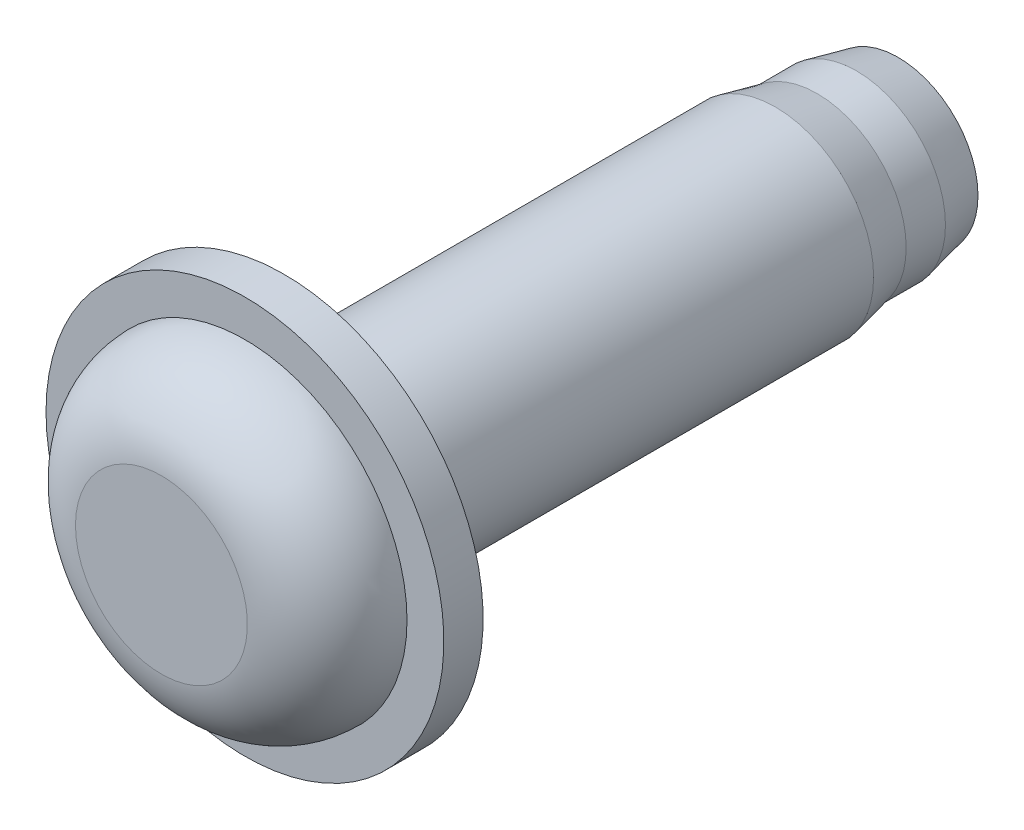
ISO-10303-21;
HEADER;
FILE_DESCRIPTION(('STEP AP214'),'2;1');
FILE_NAME('part.step','',(''),(''),'','','');
FILE_SCHEMA(('AUTOMOTIVE_DESIGN { 1 0 10303 214 1 1 1 1 }'));
ENDSEC;
DATA;
#1=APPLICATION_CONTEXT('core data for automotive mechanical design processes');
#2=APPLICATION_PROTOCOL_DEFINITION('international standard','automotive_design',2000,#1);
#3=PRODUCT_CONTEXT('',#1,'mechanical');
#4=PRODUCT('Part','Part','',(#3));
#5=PRODUCT_RELATED_PRODUCT_CATEGORY('part','',(#4));
#6=PRODUCT_DEFINITION_FORMATION('','',#4);
#7=PRODUCT_DEFINITION_CONTEXT('part definition',#1,'design');
#8=PRODUCT_DEFINITION('design','',#6,#7);
#9=PRODUCT_DEFINITION_SHAPE('','',#8);
#10=(LENGTH_UNIT() NAMED_UNIT(*) SI_UNIT(.MILLI.,.METRE.));
#11=(NAMED_UNIT(*) PLANE_ANGLE_UNIT() SI_UNIT($,.RADIAN.));
#12=(NAMED_UNIT(*) SI_UNIT($,.STERADIAN.) SOLID_ANGLE_UNIT());
#13=UNCERTAINTY_MEASURE_WITH_UNIT(LENGTH_MEASURE(1.E-05),#10,'distance_accuracy_value','');
#14=(GEOMETRIC_REPRESENTATION_CONTEXT(3) GLOBAL_UNCERTAINTY_ASSIGNED_CONTEXT((#13)) GLOBAL_UNIT_ASSIGNED_CONTEXT((#10,
#11,#12)) REPRESENTATION_CONTEXT('',''));
#15=CARTESIAN_POINT('',(0.,0.,0.));
#16=DIRECTION('',(0.,0.,1.));
#17=DIRECTION('',(1.,0.,0.));
#18=AXIS2_PLACEMENT_3D('',#15,#16,#17);
#19=CARTESIAN_POINT('',(3.542,-3.542,5.));
#20=DIRECTION('',(0.,0.,-1.));
#21=DIRECTION('',(-1.,0.,0.));
#22=AXIS2_PLACEMENT_3D('',#19,#20,#21);
#23=PLANE('',#22);
#24=CARTESIAN_POINT('',(0.,0.,5.));
#25=DIRECTION('',(0.,0.,-1.));
#26=DIRECTION('',(-1.,0.,0.));
#27=AXIS2_PLACEMENT_3D('',#24,#25,#26);
#28=CIRCLE('',#27,3.5000000032038);
#29=CARTESIAN_POINT('',(-3.5000000032038,0.,5.));
#30=VERTEX_POINT('',#29);
#31=EDGE_CURVE('E61',#30,#30,#28,.T.);
#32=ORIENTED_EDGE('',*,*,#31,.F.);
#33=EDGE_LOOP('',(#32));
#34=FACE_BOUND('',#33,.T.);
#35=ADVANCED_FACE('F16',(#34),#23,.F.);
#36=CARTESIAN_POINT('',(-3.18548387118952,0.,1.60000000024521));
#37=DIRECTION('',(0.,1.,0.));
#38=DIRECTION('',(-1.,0.,0.));
#39=AXIS2_PLACEMENT_3D('',#36,#37,#38);
#40=CIRCLE('',#39,3.41451612906277);
#41=TRIMMED_CURVE('',#40,(PARAMETER_VALUE(-2.77324600670561)),
(PARAMETER_VALUE(2.77324600670561)),.T.,.PARAMETER.);
#42=CARTESIAN_POINT('',(0.,0.,1.60000000024521));
#43=DIRECTION('',(0.,0.,-1.));
#44=AXIS1_PLACEMENT('',#42,#43);
#45=SURFACE_OF_REVOLUTION('',#41,#44);
#46=ORIENTED_EDGE('',*,*,#31,.T.);
#47=EDGE_LOOP('',(#46));
#48=FACE_BOUND('',#47,.T.);
#49=CARTESIAN_POINT('',(0.,0.,1.6));
#50=DIRECTION('',(0.,0.,-1.));
#51=DIRECTION('',(-1.,0.,0.));
#52=AXIS2_PLACEMENT_3D('',#49,#50,#51);
#53=CIRCLE('',#52,6.60000000025228);
#54=CARTESIAN_POINT('',(-6.60000000025228,0.,1.6));
#55=VERTEX_POINT('',#54);
#56=EDGE_CURVE('E297',#55,#55,#53,.F.);
#57=ORIENTED_EDGE('',*,*,#56,.T.);
#58=EDGE_LOOP('',(#57));
#59=FACE_BOUND('',#58,.T.);
#60=ADVANCED_FACE('F151',(#48,#59),#45,.F.);
#61=CARTESIAN_POINT('',(8.1972,-8.1972,1.6));
#62=DIRECTION('',(0.,0.,-1.));
#63=DIRECTION('',(-1.,0.,0.));
#64=AXIS2_PLACEMENT_3D('',#61,#62,#63);
#65=PLANE('',#64);
#66=CARTESIAN_POINT('',(0.,0.,1.6));
#67=DIRECTION('',(0.,0.,-1.));
#68=DIRECTION('',(-1.,0.,0.));
#69=AXIS2_PLACEMENT_3D('',#66,#67,#68);
#70=CIRCLE('',#69,8.1);
#71=CARTESIAN_POINT('',(-8.1,0.,1.6));
#72=VERTEX_POINT('',#71);
#73=EDGE_CURVE('E299',#72,#72,#70,.T.);
#74=ORIENTED_EDGE('',*,*,#73,.F.);
#75=EDGE_LOOP('',(#74));
#76=FACE_BOUND('',#75,.T.);
#77=ORIENTED_EDGE('',*,*,#56,.F.);
#78=EDGE_LOOP('',(#77));
#79=FACE_BOUND('',#78,.T.);
#80=ADVANCED_FACE('F153',(#76,#79),#65,.F.);
#81=CARTESIAN_POINT('',(0.,0.,1.6));
#82=DIRECTION('',(0.,0.,-1.));
#83=DIRECTION('',(-1.,0.,0.));
#84=AXIS2_PLACEMENT_3D('',#81,#82,#83);
#85=CYLINDRICAL_SURFACE('',#84,8.1);
#86=ORIENTED_EDGE('',*,*,#73,.T.);
#87=EDGE_LOOP('',(#86));
#88=FACE_BOUND('',#87,.T.);
#89=CARTESIAN_POINT('',(0.,0.,0.));
#90=DIRECTION('',(0.,0.,-1.));
#91=DIRECTION('',(-1.,0.,0.));
#92=AXIS2_PLACEMENT_3D('',#89,#90,#91);
#93=CIRCLE('',#92,8.1);
#94=CARTESIAN_POINT('',(-8.1,0.,0.));
#95=VERTEX_POINT('',#94);
#96=EDGE_CURVE('E52',#95,#95,#93,.T.);
#97=ORIENTED_EDGE('',*,*,#96,.F.);
#98=EDGE_LOOP('',(#97));
#99=FACE_BOUND('',#98,.T.);
#100=ADVANCED_FACE('F98',(#88,#99),#85,.T.);
#101=CARTESIAN_POINT('',(8.1972,-8.1972,0.));
#102=DIRECTION('',(0.,0.,-1.));
#103=DIRECTION('',(-1.,0.,0.));
#104=AXIS2_PLACEMENT_3D('',#101,#102,#103);
#105=PLANE('',#104);
#106=ORIENTED_EDGE('',*,*,#96,.T.);
#107=EDGE_LOOP('',(#106));
#108=FACE_BOUND('',#107,.T.);
#109=CARTESIAN_POINT('',(4.8253972424776,0.,-6.57506627269044E-08));
#110=CARTESIAN_POINT('',(4.82539477935394,-0.0789553557433755,-6.4380846902761E-08));
#111=CARTESIAN_POINT('',(4.82345117461643,-0.157910467758003,-6.30324329299108E-08));
#112=CARTESIAN_POINT('',(4.81569371774048,-0.315630151907436,-6.03784123595848E-08));
#113=CARTESIAN_POINT('',(4.80987987555875,-0.394394724531905,-5.90728056519905E-08));
#114=CARTESIAN_POINT('',(4.79439399940444,-0.551543483534418,-5.65043995406989E-08));
#115=CARTESIAN_POINT('',(4.78472197535761,-0.629927670890534,-5.52416000268826E-08));
#116=CARTESIAN_POINT('',(4.76154358403176,-0.786126852819703,-5.27588082268534E-08));
#117=CARTESIAN_POINT('',(4.7480372266172,-0.863941848856566,-5.15388158305212E-08));
#118=CARTESIAN_POINT('',(4.71722258481871,-1.01881518099774,-4.91416382084334E-08));
#119=CARTESIAN_POINT('',(4.6999143102159,-1.09587351904816,-4.79644528725582E-08));
#120=CARTESIAN_POINT('',(4.66153758865799,-1.24904790067994,-4.56528896757863E-08));
#121=CARTESIAN_POINT('',(4.64046915137664,-1.32516394668499,-4.45185117047685E-08));
#122=CARTESIAN_POINT('',(4.59462286936361,-1.4762703783527,-4.22925629444992E-08));
#123=CARTESIAN_POINT('',(4.56984503417511,-1.5512607669108,-4.12009920451267E-08));
#124=CARTESIAN_POINT('',(4.51663967013119,-1.69993523119347,-3.90606574292364E-08));
#125=CARTESIAN_POINT('',(4.48821215066538,-1.77361931027826,-3.8011893602597E-08));
#126=CARTESIAN_POINT('',(4.42777592050156,-1.91950365089756,-3.59571734210328E-08));
#127=CARTESIAN_POINT('',(4.39576721901699,-1.99170391624895,-3.49512169559851E-08));
#128=CARTESIAN_POINT('',(4.32824575520383,-2.13444670028062,-3.29821112084447E-08));
#129=CARTESIAN_POINT('',(4.29273300189028,-2.20498922322528,-3.20189618158294E-08));
#130=CARTESIAN_POINT('',(4.21828900573066,-2.34424658785215,-3.01354702135726E-08));
#131=CARTESIAN_POINT('',(4.17935777167953,-2.41296143423596,-2.92151278938079E-08));
#132=CARTESIAN_POINT('',(4.09817062040196,-2.54839791506044,-2.74172507247376E-08));
#133=CARTESIAN_POINT('',(4.05591471172918,-2.61511955462859,-2.65397157653074E-08));
#134=CARTESIAN_POINT('',(3.96818002649758,-2.74640889380177,-2.4827453033915E-08));
#135=CARTESIAN_POINT('',(3.92270125823053,-2.81097659894781,-2.39927251518283E-08));
#136=CARTESIAN_POINT('',(3.82863043273173,-2.93780253110083,-2.2366076552243E-08));
#137=CARTESIAN_POINT('',(3.78003838350987,-3.00006076404899,-2.15741557246196E-08));
#138=CARTESIAN_POINT('',(3.67985807462435,-3.12211777815143,-2.0033121608472E-08));
#139=CARTESIAN_POINT('',(3.6282698226694,-3.18191656563276,-1.92840082098216E-08));
#140=CARTESIAN_POINT('',(3.52222140435343,-3.29891064093805,-1.78285883438239E-08));
#141=CARTESIAN_POINT('',(3.46776124538138,-3.3561059354597,-1.71222817663513E-08));
#142=CARTESIAN_POINT('',(3.35610022710299,-3.46775524976601,-1.57524762983388E-08));
#143=CARTESIAN_POINT('',(3.29889937484808,-3.52220927660285,-1.50889772976711E-08));
#144=CARTESIAN_POINT('',(3.18189478597086,-3.62824488512294,-1.38047863032778E-08));
#145=CARTESIAN_POINT('',(3.12209105604547,-3.67982647419587,-1.31840941994256E-08));
#146=CARTESIAN_POINT('',(3.00002479764547,-3.77999295740063,-1.19855172282735E-08));
#147=CARTESIAN_POINT('',(2.93776227549712,-3.82857785924185,-1.14076322508458E-08));
#148=CARTESIAN_POINT('',(2.81092844117394,-3.92263393811751,-1.02946697277747E-08));
#149=CARTESIAN_POINT('',(2.74635713493946,-3.96810512316246,-9.7595920720024E-09));
#150=CARTESIAN_POINT('',(2.61506130225803,-4.0558242403974,-8.7322440490727E-09));
#151=CARTESIAN_POINT('',(2.54833678135122,-4.09807218087973,-8.23997357178619E-09));
#152=CARTESIAN_POINT('',(2.41289527562168,-4.1792430465882,-7.29823984959641E-09));
#153=CARTESIAN_POINT('',(2.34417829592553,-4.21816598036853,-6.84877649456366E-09));
#154=CARTESIAN_POINT('',(2.2049174280937,-4.29259308101012,-5.99265695129828E-09));
#155=CARTESIAN_POINT('',(2.13437354465867,-4.3280972566668,-5.58600065293577E-09));
#156=CARTESIAN_POINT('',(1.99162882514801,-4.3956013260349,-4.81549554157689E-09));
#157=CARTESIAN_POINT('',(1.91942799333582,-4.42760122876179,-4.45164661844926E-09));
#158=CARTESIAN_POINT('',(1.77354332371691,-4.48801967953694,-3.76675591624756E-09));
#159=CARTESIAN_POINT('',(1.69985948972612,-4.51643823679902,-3.44571402704254E-09));
#160=CARTESIAN_POINT('',(1.55118633422878,-4.56962555300738,-2.84643757201036E-09));
#161=CARTESIAN_POINT('',(1.47619701608146,-4.59439432134362,-2.56820289605122E-09));
#162=CARTESIAN_POINT('',(1.32509355469223,-4.64022240562619,-2.05454092520999E-09));
#163=CARTESIAN_POINT('',(1.24897941434475,-4.66128173111601,-1.8191135201952E-09));
#164=CARTESIAN_POINT('',(1.09580968047602,-4.69964022518876,-1.39106568112734E-09));
#165=CARTESIAN_POINT('',(1.01875408937743,-4.7169394034457,-1.19844513694205E-09));
#166=CARTESIAN_POINT('',(0.863887090655041,-4.74773590926214,-8.56011734932264E-10));
#167=CARTESIAN_POINT('',(0.786075684976319,-4.76123324660296,-7.06198766973143E-10));
#168=CARTESIAN_POINT('',(0.629884522440661,-4.78439371533586,-4.49379800667217E-10));
#169=CARTESIAN_POINT('',(0.551504767046501,-4.79405685659253,-3.42373692187062E-10));
#170=CARTESIAN_POINT('',(0.394365705712439,-4.80952514562065,-1.71168861710574E-10));
#171=CARTESIAN_POINT('',(0.315606400749572,-4.81533030331795,-1.06970029579249E-10));
#172=CARTESIAN_POINT('',(0.157898077293436,-4.823070630132,-2.13796684277793E-11));
#173=CARTESIAN_POINT('',(0.0789490592887887,-4.82500580920552,0.));
#174=CARTESIAN_POINT('',(0.,-4.8249999965264,0.));
#175=B_SPLINE_CURVE_WITH_KNOTS('',3,(#109,#110,#111,#112,#113,#114,#115,#116,#117,#118,#119,
#120,#121,#122,#123,#124,#125,#126,#127,#128,#129,#130,#131,#132,#133,#134,#135,#136,#137,#138,
#139,#140,#141,#142,#143,#144,#145,#146,#147,#148,#149,#150,#151,#152,#153,#154,#155,#156,#157,
#158,#159,#160,#161,#162,#163,#164,#165,#166,#167,#168,#169,#170,#171,#172,#173,#174),
.UNSPECIFIED.,.F.,.F.,(4,2,2,2,2,2,2,2,2,2,2,2,2,2,2,2,2,2,2,2,2,2,2,2,2,2,2,2,2,2,2,2,4),(0.,
0.236842048554856,0.473683487803254,0.710524317745194,0.947364538380672,1.18420414970968,
1.42104315173223,1.65788154444831,1.89471932785792,2.13155650196106,2.36839306675772,
2.60522902224792,2.84206436843163,3.07889910530887,3.31573323287964,3.55256675114393,
3.78939966010173,4.02623195975305,4.26306365009789,4.49989473113625,4.73672520286813,
4.97355506529351,5.21038431841242,5.44721296222483,5.68404099673076,5.92086842193021,
6.15769523782316,6.39452144440963,6.63134704168961,6.86817202966309,7.1049964083301,
7.3418201776906,7.57864333774462),.UNSPECIFIED.);
#176=CARTESIAN_POINT('',(0.,-4.8249999973948,0.));
#177=VERTEX_POINT('',#176);
#178=CARTESIAN_POINT('',(4.82539724248631,0.,-3.94503976361427E-08));
#179=VERTEX_POINT('',#178);
#180=EDGE_CURVE('E34',#177,#179,#175,.F.);
#181=ORIENTED_EDGE('',*,*,#180,.T.);
#182=CARTESIAN_POINT('',(0.,4.8249999965264,0.));
#183=CARTESIAN_POINT('',(0.0789490592887863,4.82500580920552,0.));
#184=CARTESIAN_POINT('',(0.157898077293432,4.823070630132,-2.13796684277828E-11));
#185=CARTESIAN_POINT('',(0.315606400749569,4.81533030331795,-1.06970029579247E-10));
#186=CARTESIAN_POINT('',(0.394365705712438,4.80952514562065,-1.7116886171057E-10));
#187=CARTESIAN_POINT('',(0.5515047670465,4.79405685659253,-3.42373692187062E-10));
#188=CARTESIAN_POINT('',(0.629884522440659,4.78439371533586,-4.49379800667221E-10));
#189=CARTESIAN_POINT('',(0.786075684976318,4.76123324660296,-7.06198766973144E-10));
#190=CARTESIAN_POINT('',(0.863887090655041,4.74773590926214,-8.56011734932261E-10));
#191=CARTESIAN_POINT('',(1.01875408937743,4.7169394034457,-1.19844513694204E-09));
#192=CARTESIAN_POINT('',(1.09580968047602,4.69964022518877,-1.39106568112734E-09));
#193=CARTESIAN_POINT('',(1.24897941434475,4.66128173111601,-1.8191135201952E-09));
#194=CARTESIAN_POINT('',(1.32509355469223,4.64022240562619,-2.05454092520999E-09));
#195=CARTESIAN_POINT('',(1.47619701608146,4.59439432134362,-2.56820289605122E-09));
#196=CARTESIAN_POINT('',(1.55118633422878,4.56962555300738,-2.84643757201036E-09));
#197=CARTESIAN_POINT('',(1.69985948972612,4.51643823679902,-3.44571402704253E-09));
#198=CARTESIAN_POINT('',(1.77354332371691,4.48801967953694,-3.76675591624756E-09));
#199=CARTESIAN_POINT('',(1.91942799333582,4.42760122876179,-4.45164661844926E-09));
#200=CARTESIAN_POINT('',(1.99162882514801,4.3956013260349,-4.81549554157689E-09));
#201=CARTESIAN_POINT('',(2.13437354465867,4.32809725666681,-5.58600065293577E-09));
#202=CARTESIAN_POINT('',(2.2049174280937,4.29259308101012,-5.99265695129828E-09));
#203=CARTESIAN_POINT('',(2.34417829592553,4.21816598036853,-6.84877649456366E-09));
#204=CARTESIAN_POINT('',(2.41289527562168,4.1792430465882,-7.29823984959641E-09));
#205=CARTESIAN_POINT('',(2.54833678135122,4.09807218087973,-8.23997357178619E-09));
#206=CARTESIAN_POINT('',(2.61506130225803,4.0558242403974,-8.7322440490727E-09));
#207=CARTESIAN_POINT('',(2.74635713493946,3.96810512316246,-9.7595920720024E-09));
#208=CARTESIAN_POINT('',(2.81092844117394,3.92263393811751,-1.02946697277747E-08));
#209=CARTESIAN_POINT('',(2.93776227549712,3.82857785924185,-1.14076322508458E-08));
#210=CARTESIAN_POINT('',(3.00002479764547,3.77999295740063,-1.19855172282735E-08));
#211=CARTESIAN_POINT('',(3.12209105604547,3.67982647419587,-1.31840941994256E-08));
#212=CARTESIAN_POINT('',(3.18189478597086,3.62824488512295,-1.38047863032778E-08));
#213=CARTESIAN_POINT('',(3.29889937484808,3.52220927660286,-1.50889772976711E-08));
#214=CARTESIAN_POINT('',(3.35610022710299,3.46775524976601,-1.57524762983388E-08));
#215=CARTESIAN_POINT('',(3.46776124538138,3.3561059354597,-1.71222817663513E-08));
#216=CARTESIAN_POINT('',(3.52222140435342,3.29891064093805,-1.78285883438239E-08));
#217=CARTESIAN_POINT('',(3.62826982266939,3.18191656563276,-1.92840082098216E-08));
#218=CARTESIAN_POINT('',(3.67985807462435,3.12211777815143,-2.0033121608472E-08));
#219=CARTESIAN_POINT('',(3.78003838350987,3.00006076404899,-2.15741557246196E-08));
#220=CARTESIAN_POINT('',(3.82863043273173,2.93780253110083,-2.2366076552243E-08));
#221=CARTESIAN_POINT('',(3.92270125823052,2.81097659894782,-2.39927251518283E-08));
#222=CARTESIAN_POINT('',(3.96818002649758,2.74640889380177,-2.4827453033915E-08));
#223=CARTESIAN_POINT('',(4.05591471172918,2.61511955462859,-2.65397157653074E-08));
#224=CARTESIAN_POINT('',(4.09817062040196,2.54839791506044,-2.74172507247376E-08));
#225=CARTESIAN_POINT('',(4.17935777167953,2.41296143423596,-2.92151278938079E-08));
#226=CARTESIAN_POINT('',(4.21828900573066,2.34424658785215,-3.01354702135726E-08));
#227=CARTESIAN_POINT('',(4.29273300189028,2.20498922322528,-3.20189618158294E-08));
#228=CARTESIAN_POINT('',(4.32824575520383,2.13444670028063,-3.29821112084447E-08));
#229=CARTESIAN_POINT('',(4.39576721901699,1.99170391624895,-3.49512169559851E-08));
#230=CARTESIAN_POINT('',(4.42777592050156,1.91950365089756,-3.59571734210328E-08));
#231=CARTESIAN_POINT('',(4.48821215066538,1.77361931027826,-3.8011893602597E-08));
#232=CARTESIAN_POINT('',(4.51663967013119,1.69993523119347,-3.90606574292364E-08));
#233=CARTESIAN_POINT('',(4.56984503417511,1.55126076691079,-4.12009920451267E-08));
#234=CARTESIAN_POINT('',(4.59462286936361,1.4762703783527,-4.22925629444992E-08));
#235=CARTESIAN_POINT('',(4.64046915137664,1.32516394668499,-4.45185117047685E-08));
#236=CARTESIAN_POINT('',(4.66153758865799,1.24904790067995,-4.56528896757863E-08));
#237=CARTESIAN_POINT('',(4.6999143102159,1.09587351904816,-4.79644528725582E-08));
#238=CARTESIAN_POINT('',(4.71722258481871,1.01881518099775,-4.91416382084334E-08));
#239=CARTESIAN_POINT('',(4.7480372266172,0.863941848856567,-5.15388158305212E-08));
#240=CARTESIAN_POINT('',(4.76154358403176,0.786126852819704,-5.27588082268534E-08));
#241=CARTESIAN_POINT('',(4.78472197535761,0.629927670890536,-5.52416000268826E-08));
#242=CARTESIAN_POINT('',(4.79439399940444,0.55154348353442,-5.65043995406989E-08));
#243=CARTESIAN_POINT('',(4.80987987555875,0.394394724531909,-5.90728056519905E-08));
#244=CARTESIAN_POINT('',(4.81569371774048,0.315630151907439,-6.03784123595848E-08));
#245=CARTESIAN_POINT('',(4.82345117461643,0.157910467758006,-6.30324329299108E-08));
#246=CARTESIAN_POINT('',(4.82539477935394,0.0789553557433773,-6.4380846902761E-08));
#247=CARTESIAN_POINT('',(4.8253972424776,0.,-6.57506627269044E-08));
#248=B_SPLINE_CURVE_WITH_KNOTS('',3,(#182,#183,#184,#185,#186,#187,#188,#189,#190,#191,#192,
#193,#194,#195,#196,#197,#198,#199,#200,#201,#202,#203,#204,#205,#206,#207,#208,#209,#210,#211,
#212,#213,#214,#215,#216,#217,#218,#219,#220,#221,#222,#223,#224,#225,#226,#227,#228,#229,#230,
#231,#232,#233,#234,#235,#236,#237,#238,#239,#240,#241,#242,#243,#244,#245,#246,#247),
.UNSPECIFIED.,.F.,.F.,(4,2,2,2,2,2,2,2,2,2,2,2,2,2,2,2,2,2,2,2,2,2,2,2,2,2,2,2,2,2,2,2,4),(0.,
0.23682316005402,0.47364692941453,0.71047130808153,0.947296296055019,1.184121893335,
1.42094809992146,1.65777491581442,1.89460234101386,2.13143037551979,2.36825901933221,
2.60508827245111,2.8419181348765,3.07874860660838,3.31557968764673,3.55241137799157,
3.7892436776429,4.0260765866007,4.26291010486499,4.49974423243575,4.73657896931299,
4.97341431549671,5.2102502709869,5.44708683578357,5.68392400988671,5.92076179329632,
6.1576001860124,6.39443918803494,6.63127879936396,6.86811901999943,7.10495984994137,
7.34180128918977,7.57864333774463),.UNSPECIFIED.);
#249=CARTESIAN_POINT('',(0.,4.8249999965264,0.));
#250=VERTEX_POINT('',#249);
#251=EDGE_CURVE('E45',#179,#250,#248,.F.);
#252=ORIENTED_EDGE('',*,*,#251,.T.);
#253=CARTESIAN_POINT('',(0.,0.,0.));
#254=DIRECTION('',(0.,0.,-1.));
#255=DIRECTION('',(-1.,0.,0.));
#256=AXIS2_PLACEMENT_3D('',#253,#254,#255);
#257=CIRCLE('',#256,4.8249999965264);
#258=CARTESIAN_POINT('',(-4.82499999930528,0.,0.));
#259=VERTEX_POINT('',#258);
#260=EDGE_CURVE('E49',#250,#259,#257,.F.);
#261=ORIENTED_EDGE('',*,*,#260,.T.);
#262=CARTESIAN_POINT('',(0.,0.,0.));
#263=DIRECTION('',(0.,0.,-1.));
#264=DIRECTION('',(0.,-1.,0.));
#265=AXIS2_PLACEMENT_3D('',#262,#263,#264);
#266=CIRCLE('',#265,4.825);
#267=EDGE_CURVE('E41',#259,#177,#266,.F.);
#268=ORIENTED_EDGE('',*,*,#267,.T.);
#269=EDGE_LOOP('',(#181,#252,#261,#268));
#270=FACE_BOUND('',#269,.T.);
#271=ADVANCED_FACE('F48',(#108,#270),#105,.T.);
#272=CARTESIAN_POINT('',(3.289,-3.289,-25.));
#273=DIRECTION('',(0.,0.,-1.));
#274=DIRECTION('',(-1.,0.,0.));
#275=AXIS2_PLACEMENT_3D('',#272,#273,#274);
#276=PLANE('',#275);
#277=CARTESIAN_POINT('',(0.,0.,-24.9999999999773));
#278=DIRECTION('',(0.,0.,1.));
#279=DIRECTION('',(1.,0.,0.));
#280=AXIS2_PLACEMENT_3D('',#277,#278,#279);
#281=CIRCLE('',#280,3.25000000000841);
#282=CARTESIAN_POINT('',(3.25000000000841,0.,-24.9999999999773));
#283=VERTEX_POINT('',#282);
#284=EDGE_CURVE('E145',#283,#283,#281,.T.);
#285=ORIENTED_EDGE('',*,*,#284,.F.);
#286=EDGE_LOOP('',(#285));
#287=FACE_BOUND('',#286,.T.);
#288=ADVANCED_FACE('F76',(#287),#276,.T.);
#289=CARTESIAN_POINT('',(0.,0.,-1.2));
#290=DIRECTION('',(0.,0.,-1.));
#291=DIRECTION('',(-1.,0.,0.));
#292=AXIS2_PLACEMENT_3D('',#289,#290,#291);
#293=TOROIDAL_SURFACE('',#292,4.825,1.2);
#294=ORIENTED_EDGE('',*,*,#267,.F.);
#295=ORIENTED_EDGE('',*,*,#260,.F.);
#296=ORIENTED_EDGE('',*,*,#251,.F.);
#297=ORIENTED_EDGE('',*,*,#180,.F.);
#298=EDGE_LOOP('',(#294,#295,#296,#297));
#299=FACE_BOUND('',#298,.T.);
#300=CARTESIAN_POINT('',(0.,0.,-1.2));
#301=DIRECTION('',(0.,0.,-1.));
#302=DIRECTION('',(-1.,0.,0.));
#303=AXIS2_PLACEMENT_3D('',#300,#301,#302);
#304=CIRCLE('',#303,3.625);
#305=CARTESIAN_POINT('',(-3.625,0.,-1.2));
#306=VERTEX_POINT('',#305);
#307=EDGE_CURVE('E137',#306,#306,#304,.T.);
#308=ORIENTED_EDGE('',*,*,#307,.F.);
#309=EDGE_LOOP('',(#308));
#310=FACE_BOUND('',#309,.T.);
#311=ADVANCED_FACE('F56',(#299,#310),#293,.F.);
#312=CARTESIAN_POINT('',(0.,0.,-23.3000000000061));
#313=DIRECTION('',(0.,0.,1.));
#314=DIRECTION('',(1.,0.,0.));
#315=AXIS2_PLACEMENT_3D('',#312,#313,#314);
#316=CONICAL_SURFACE('',#315,3.62499999999955,0.217111314733498);
#317=CARTESIAN_POINT('',(0.,0.,-23.3));
#318=DIRECTION('',(0.,0.,-1.));
#319=DIRECTION('',(0.,1.,0.));
#320=AXIS2_PLACEMENT_3D('',#317,#318,#319);
#321=CIRCLE('',#320,3.625);
#322=CARTESIAN_POINT('',(0.,3.625,-23.3));
#323=VERTEX_POINT('',#322);
#324=EDGE_CURVE('E84',#323,#323,#321,.F.);
#325=ORIENTED_EDGE('',*,*,#324,.F.);
#326=EDGE_LOOP('',(#325));
#327=FACE_BOUND('',#326,.T.);
#328=ORIENTED_EDGE('',*,*,#284,.T.);
#329=EDGE_LOOP('',(#328));
#330=FACE_BOUND('',#329,.T.);
#331=ADVANCED_FACE('F75',(#327,#330),#316,.T.);
#332=CARTESIAN_POINT('',(0.,0.,-1.2));
#333=DIRECTION('',(0.,0.,-1.));
#334=DIRECTION('',(-1.,0.,0.));
#335=AXIS2_PLACEMENT_3D('',#332,#333,#334);
#336=CYLINDRICAL_SURFACE('',#335,3.625);
#337=ORIENTED_EDGE('',*,*,#307,.T.);
#338=EDGE_LOOP('',(#337));
#339=FACE_BOUND('',#338,.T.);
#340=CARTESIAN_POINT('',(0.,0.,-2.12499999992133));
#341=DIRECTION('',(0.,0.,-1.));
#342=DIRECTION('',(-1.,0.,0.));
#343=AXIS2_PLACEMENT_3D('',#340,#341,#342);
#344=CIRCLE('',#343,3.62499999999955);
#345=CARTESIAN_POINT('',(-3.62499999999954,0.,-2.12499999992133));
#346=VERTEX_POINT('',#345);
#347=EDGE_CURVE('E194',#346,#346,#344,.T.);
#348=ORIENTED_EDGE('',*,*,#347,.F.);
#349=EDGE_LOOP('',(#348));
#350=FACE_BOUND('',#349,.T.);
#351=ADVANCED_FACE('F182',(#339,#350),#336,.T.);
#352=CARTESIAN_POINT('',(0.,0.,-21.7));
#353=DIRECTION('',(0.,0.,-1.));
#354=DIRECTION('',(0.,1.,0.));
#355=AXIS2_PLACEMENT_3D('',#352,#353,#354);
#356=CYLINDRICAL_SURFACE('',#355,3.625);
#357=ORIENTED_EDGE('',*,*,#324,.T.);
#358=EDGE_LOOP('',(#357));
#359=FACE_BOUND('',#358,.T.);
#360=CARTESIAN_POINT('',(0.,0.,-21.7000000000098));
#361=DIRECTION('',(0.,0.,1.));
#362=DIRECTION('',(0.,-1.,0.));
#363=AXIS2_PLACEMENT_3D('',#360,#361,#362);
#364=CIRCLE('',#363,3.62500000001376);
#365=CARTESIAN_POINT('',(0.,-3.62500000001376,-21.7000000000098));
#366=VERTEX_POINT('',#365);
#367=EDGE_CURVE('E195',#366,#366,#364,.T.);
#368=ORIENTED_EDGE('',*,*,#367,.F.);
#369=EDGE_LOOP('',(#368));
#370=FACE_BOUND('',#369,.T.);
#371=ADVANCED_FACE('F179',(#359,#370),#356,.T.);
#372=CARTESIAN_POINT('',(0.,0.,-2.49999999999773));
#373=DIRECTION('',(0.,0.,-1.));
#374=DIRECTION('',(-1.,0.,0.));
#375=AXIS2_PLACEMENT_3D('',#372,#373,#374);
#376=CONICAL_SURFACE('',#375,4.00000000007594,0.785398163397448);
#377=ORIENTED_EDGE('',*,*,#347,.T.);
#378=EDGE_LOOP('',(#377));
#379=FACE_BOUND('',#378,.T.);
#380=CARTESIAN_POINT('',(0.,0.,-2.49999999999995));
#381=DIRECTION('',(0.,0.,-1.));
#382=DIRECTION('',(0.,1.,0.));
#383=AXIS2_PLACEMENT_3D('',#380,#381,#382);
#384=CIRCLE('',#383,4.);
#385=CARTESIAN_POINT('',(0.,4.,-2.49999999999995));
#386=VERTEX_POINT('',#385);
#387=EDGE_CURVE('E26',#386,#386,#384,.T.);
#388=ORIENTED_EDGE('',*,*,#387,.F.);
#389=EDGE_LOOP('',(#388));
#390=FACE_BOUND('',#389,.T.);
#391=ADVANCED_FACE('F172',(#379,#390),#376,.T.);
#392=CARTESIAN_POINT('',(0.,0.,-20.0000000000955));
#393=DIRECTION('',(0.,0.,1.));
#394=DIRECTION('',(0.,-1.,0.));
#395=AXIS2_PLACEMENT_3D('',#392,#393,#394);
#396=CONICAL_SURFACE('',#395,4.00000000000489,0.217111314742407);
#397=CARTESIAN_POINT('',(0.,0.,-20.));
#398=DIRECTION('',(0.,0.,-1.));
#399=DIRECTION('',(0.,1.,0.));
#400=AXIS2_PLACEMENT_3D('',#397,#398,#399);
#401=CIRCLE('',#400,4.);
#402=CARTESIAN_POINT('',(0.,4.,-20.));
#403=VERTEX_POINT('',#402);
#404=EDGE_CURVE('E11',#403,#403,#401,.F.);
#405=ORIENTED_EDGE('',*,*,#404,.F.);
#406=EDGE_LOOP('',(#405));
#407=FACE_BOUND('',#406,.T.);
#408=ORIENTED_EDGE('',*,*,#367,.T.);
#409=EDGE_LOOP('',(#408));
#410=FACE_BOUND('',#409,.T.);
#411=ADVANCED_FACE('F166',(#407,#410),#396,.T.);
#412=CARTESIAN_POINT('',(0.,0.,-2.5));
#413=DIRECTION('',(0.,0.,-1.));
#414=DIRECTION('',(0.,1.,0.));
#415=AXIS2_PLACEMENT_3D('',#412,#413,#414);
#416=CYLINDRICAL_SURFACE('',#415,4.);
#417=ORIENTED_EDGE('',*,*,#404,.T.);
#418=EDGE_LOOP('',(#417));
#419=FACE_BOUND('',#418,.T.);
#420=ORIENTED_EDGE('',*,*,#387,.T.);
#421=EDGE_LOOP('',(#420));
#422=FACE_BOUND('',#421,.T.);
#423=ADVANCED_FACE('F164',(#419,#422),#416,.T.);
#424=CLOSED_SHELL('',(#35,#60,#80,#100,#271,#288,#311,#331,#351,#371,#391,#411,#423));
#425=MANIFOLD_SOLID_BREP('B1',#424);
#426=ADVANCED_BREP_SHAPE_REPRESENTATION('',(#18,#425),#14);
#427=SHAPE_DEFINITION_REPRESENTATION(#9,#426);
ENDSEC;
END-ISO-10303-21;
